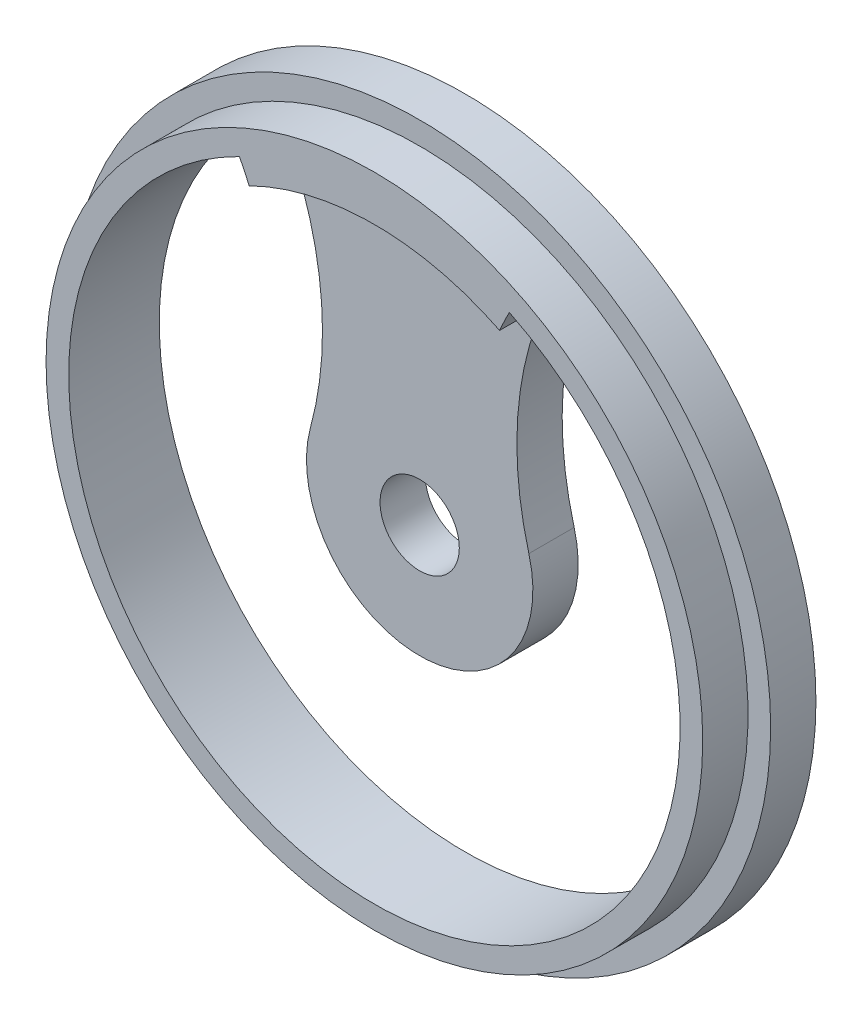
ISO-10303-21;
HEADER;
FILE_DESCRIPTION(('STEP AP214'),'2;1');
FILE_NAME('part.step','',(''),(''),'','','');
FILE_SCHEMA(('AUTOMOTIVE_DESIGN { 1 0 10303 214 1 1 1 1 }'));
ENDSEC;
DATA;
#1=APPLICATION_CONTEXT('core data for automotive mechanical design processes');
#2=APPLICATION_PROTOCOL_DEFINITION('international standard','automotive_design',2000,#1);
#3=PRODUCT_CONTEXT('',#1,'mechanical');
#4=PRODUCT('Part','Part','',(#3));
#5=PRODUCT_RELATED_PRODUCT_CATEGORY('part','',(#4));
#6=PRODUCT_DEFINITION_FORMATION('','',#4);
#7=PRODUCT_DEFINITION_CONTEXT('part definition',#1,'design');
#8=PRODUCT_DEFINITION('design','',#6,#7);
#9=PRODUCT_DEFINITION_SHAPE('','',#8);
#10=(LENGTH_UNIT() NAMED_UNIT(*) SI_UNIT(.MILLI.,.METRE.));
#11=(NAMED_UNIT(*) PLANE_ANGLE_UNIT() SI_UNIT($,.RADIAN.));
#12=(NAMED_UNIT(*) SI_UNIT($,.STERADIAN.) SOLID_ANGLE_UNIT());
#13=UNCERTAINTY_MEASURE_WITH_UNIT(LENGTH_MEASURE(1.E-05),#10,'distance_accuracy_value','');
#14=(GEOMETRIC_REPRESENTATION_CONTEXT(3) GLOBAL_UNCERTAINTY_ASSIGNED_CONTEXT((#13)) GLOBAL_UNIT_ASSIGNED_CONTEXT((#10,
#11,#12)) REPRESENTATION_CONTEXT('',''));
#15=CARTESIAN_POINT('',(0.,0.,0.));
#16=DIRECTION('',(0.,0.,1.));
#17=DIRECTION('',(1.,0.,0.));
#18=AXIS2_PLACEMENT_3D('',#15,#16,#17);
#19=CARTESIAN_POINT('',(0.,0.,2.));
#20=DIRECTION('',(0.,0.,-1.));
#21=DIRECTION('',(-1.,0.,0.));
#22=AXIS2_PLACEMENT_3D('',#19,#20,#21);
#23=CYLINDRICAL_SURFACE('',#22,14.5);
#24=CARTESIAN_POINT('',(0.,0.,4.));
#25=DIRECTION('',(0.,0.,1.));
#26=DIRECTION('',(1.,0.,0.));
#27=AXIS2_PLACEMENT_3D('',#24,#25,#26);
#28=CIRCLE('',#27,14.5);
#29=CARTESIAN_POINT('',(14.5,0.,4.));
#30=VERTEX_POINT('',#29);
#31=EDGE_CURVE('E161',#30,#30,#28,.T.);
#32=ORIENTED_EDGE('',*,*,#31,.F.);
#33=EDGE_LOOP('',(#32));
#34=FACE_BOUND('',#33,.T.);
#35=CARTESIAN_POINT('',(0.,0.,2.));
#36=DIRECTION('',(0.,0.,-1.));
#37=DIRECTION('',(-1.,0.,0.));
#38=AXIS2_PLACEMENT_3D('',#35,#36,#37);
#39=CIRCLE('',#38,14.5);
#40=CARTESIAN_POINT('',(-14.5,0.,2.));
#41=VERTEX_POINT('',#40);
#42=EDGE_CURVE('E169',#41,#41,#39,.T.);
#43=ORIENTED_EDGE('',*,*,#42,.F.);
#44=EDGE_LOOP('',(#43));
#45=FACE_BOUND('',#44,.T.);
#46=ADVANCED_FACE('F39',(#34,#45),#23,.T.);
#47=CARTESIAN_POINT('',(0.,0.,0.));
#48=DIRECTION('',(0.,0.,1.));
#49=DIRECTION('',(1.,0.,0.));
#50=AXIS2_PLACEMENT_3D('',#47,#48,#49);
#51=PLANE('',#50);
#52=CARTESIAN_POINT('',(-19.2031533069764,5.2610638794004,0.));
#53=DIRECTION('',(0.,0.,-1.));
#54=DIRECTION('',(1.,0.,0.));
#55=AXIS2_PLACEMENT_3D('',#52,#53,#54);
#56=CIRCLE('',#55,14.9107983284038);
#57=CARTESIAN_POINT('',(-5.96000858501853,12.1131456552997,0.));
#58=VERTEX_POINT('',#57);
#59=CARTESIAN_POINT('',(-4.82229617071206,1.32115844694565,0.));
#60=VERTEX_POINT('',#59);
#61=EDGE_CURVE('E123',#58,#60,#56,.T.);
#62=ORIENTED_EDGE('',*,*,#61,.F.);
#63=CARTESIAN_POINT('',(0.,0.,0.));
#64=DIRECTION('',(0.,0.,-1.));
#65=DIRECTION('',(-1.,0.,0.));
#66=AXIS2_PLACEMENT_3D('',#63,#64,#65);
#67=CIRCLE('',#66,13.5);
#68=CARTESIAN_POINT('',(5.96000858501854,12.1131456552997,0.));
#69=VERTEX_POINT('',#68);
#70=EDGE_CURVE('E54',#69,#58,#67,.T.);
#71=ORIENTED_EDGE('',*,*,#70,.F.);
#72=CARTESIAN_POINT('',(19.2031533069764,5.2610638794004,0.));
#73=DIRECTION('',(0.,0.,-1.));
#74=DIRECTION('',(-1.,0.,0.));
#75=AXIS2_PLACEMENT_3D('',#72,#73,#74);
#76=CIRCLE('',#75,14.9107983284038);
#77=CARTESIAN_POINT('',(4.82229617071206,1.32115844694565,0.));
#78=VERTEX_POINT('',#77);
#79=EDGE_CURVE('E112',#78,#69,#76,.T.);
#80=ORIENTED_EDGE('',*,*,#79,.F.);
#81=CARTESIAN_POINT('',(0.,0.,0.));
#82=DIRECTION('',(0.,0.,1.));
#83=DIRECTION('',(-1.,0.,0.));
#84=AXIS2_PLACEMENT_3D('',#81,#82,#83);
#85=CIRCLE('',#84,5.);
#86=EDGE_CURVE('E116',#60,#78,#85,.T.);
#87=ORIENTED_EDGE('',*,*,#86,.F.);
#88=EDGE_LOOP('',(#62,#71,#80,#87));
#89=FACE_BOUND('',#88,.T.);
#90=CARTESIAN_POINT('',(0.,0.,0.));
#91=DIRECTION('',(0.,0.,1.));
#92=DIRECTION('',(1.,0.,0.));
#93=AXIS2_PLACEMENT_3D('',#90,#91,#92);
#94=CIRCLE('',#93,1.75);
#95=CARTESIAN_POINT('',(1.75,0.,0.));
#96=VERTEX_POINT('',#95);
#97=EDGE_CURVE('E151',#96,#96,#94,.T.);
#98=ORIENTED_EDGE('',*,*,#97,.T.);
#99=EDGE_LOOP('',(#98));
#100=FACE_BOUND('',#99,.T.);
#101=CARTESIAN_POINT('',(0.,0.,0.));
#102=DIRECTION('',(0.,0.,-1.));
#103=DIRECTION('',(-1.,0.,0.));
#104=AXIS2_PLACEMENT_3D('',#101,#102,#103);
#105=CIRCLE('',#104,15.5);
#106=CARTESIAN_POINT('',(-15.5,0.,0.));
#107=VERTEX_POINT('',#106);
#108=EDGE_CURVE('E142',#107,#107,#105,.T.);
#109=ORIENTED_EDGE('',*,*,#108,.T.);
#110=EDGE_LOOP('',(#109));
#111=FACE_BOUND('',#110,.T.);
#112=ADVANCED_FACE('F194',(#89,#100,#111),#51,.F.);
#113=CARTESIAN_POINT('',(0.,0.,4.));
#114=DIRECTION('',(0.,0.,1.));
#115=DIRECTION('',(1.,0.,0.));
#116=AXIS2_PLACEMENT_3D('',#113,#114,#115);
#117=PLANE('',#116);
#118=CARTESIAN_POINT('',(19.2031533069764,5.2610638794004,4.));
#119=DIRECTION('',(0.,0.,-1.));
#120=DIRECTION('',(-1.,0.,0.));
#121=AXIS2_PLACEMENT_3D('',#118,#119,#120);
#122=CIRCLE('',#121,14.9107983284038);
#123=CARTESIAN_POINT('',(5.53047294116341,11.2099896987936,4.));
#124=VERTEX_POINT('',#123);
#125=CARTESIAN_POINT('',(5.96000858501854,12.1131456552997,4.));
#126=VERTEX_POINT('',#125);
#127=EDGE_CURVE('E97',#124,#126,#122,.T.);
#128=ORIENTED_EDGE('',*,*,#127,.T.);
#129=CARTESIAN_POINT('',(0.,0.,4.));
#130=DIRECTION('',(0.,0.,-1.));
#131=DIRECTION('',(-1.,0.,0.));
#132=AXIS2_PLACEMENT_3D('',#129,#130,#131);
#133=CIRCLE('',#132,13.5);
#134=CARTESIAN_POINT('',(-5.96000858501853,12.1131456552997,4.));
#135=VERTEX_POINT('',#134);
#136=EDGE_CURVE('E93',#126,#135,#133,.T.);
#137=ORIENTED_EDGE('',*,*,#136,.T.);
#138=CARTESIAN_POINT('',(-19.2031533069764,5.2610638794004,4.));
#139=DIRECTION('',(0.,0.,-1.));
#140=DIRECTION('',(1.,0.,0.));
#141=AXIS2_PLACEMENT_3D('',#138,#139,#140);
#142=CIRCLE('',#141,14.9107983284038);
#143=CARTESIAN_POINT('',(-5.53047294116341,11.2099896987936,4.));
#144=VERTEX_POINT('',#143);
#145=EDGE_CURVE('E100',#135,#144,#142,.T.);
#146=ORIENTED_EDGE('',*,*,#145,.T.);
#147=CARTESIAN_POINT('',(0.,0.,4.));
#148=DIRECTION('',(0.,0.,1.));
#149=DIRECTION('',(1.,0.,0.));
#150=AXIS2_PLACEMENT_3D('',#147,#148,#149);
#151=CIRCLE('',#150,12.5);
#152=EDGE_CURVE('E155',#124,#144,#151,.T.);
#153=ORIENTED_EDGE('',*,*,#152,.F.);
#154=EDGE_LOOP('',(#128,#137,#146,#153));
#155=FACE_BOUND('',#154,.T.);
#156=ORIENTED_EDGE('',*,*,#31,.T.);
#157=EDGE_LOOP('',(#156));
#158=FACE_BOUND('',#157,.T.);
#159=ADVANCED_FACE('F109',(#155,#158),#117,.T.);
#160=CARTESIAN_POINT('',(0.,0.,4.));
#161=DIRECTION('',(0.,0.,-1.));
#162=DIRECTION('',(-1.,0.,0.));
#163=AXIS2_PLACEMENT_3D('',#160,#161,#162);
#164=CYLINDRICAL_SURFACE('',#163,12.5);
#165=DIRECTION('',(0.,0.,-1.));
#166=VECTOR('',#165,1.);
#167=CARTESIAN_POINT('',(5.53047294116341,11.2099896987936,2.));
#168=LINE('',#167,#166);
#169=CARTESIAN_POINT('',(5.53047294116341,11.2099896987936,2.));
#170=VERTEX_POINT('',#169);
#171=EDGE_CURVE('E139',#124,#170,#168,.T.);
#172=ORIENTED_EDGE('',*,*,#171,.F.);
#173=ORIENTED_EDGE('',*,*,#152,.T.);
#174=DIRECTION('',(0.,0.,-1.));
#175=VECTOR('',#174,1.);
#176=CARTESIAN_POINT('',(-5.53047294116341,11.2099896987936,2.));
#177=LINE('',#176,#175);
#178=CARTESIAN_POINT('',(-5.53047294116341,11.2099896987936,2.));
#179=VERTEX_POINT('',#178);
#180=EDGE_CURVE('E103',#179,#144,#177,.F.);
#181=ORIENTED_EDGE('',*,*,#180,.F.);
#182=CARTESIAN_POINT('',(0.,0.,2.));
#183=DIRECTION('',(0.,0.,1.));
#184=DIRECTION('',(1.,0.,0.));
#185=AXIS2_PLACEMENT_3D('',#182,#183,#184);
#186=CIRCLE('',#185,12.5);
#187=EDGE_CURVE('E165',#179,#170,#186,.F.);
#188=ORIENTED_EDGE('',*,*,#187,.T.);
#189=EDGE_LOOP('',(#172,#173,#181,#188));
#190=FACE_BOUND('',#189,.T.);
#191=ADVANCED_FACE('F188',(#190),#164,.F.);
#192=CARTESIAN_POINT('',(0.,0.,2.));
#193=DIRECTION('',(0.,0.,1.));
#194=DIRECTION('',(1.,0.,0.));
#195=AXIS2_PLACEMENT_3D('',#192,#193,#194);
#196=PLANE('',#195);
#197=CARTESIAN_POINT('',(19.2031533069764,5.2610638794004,2.));
#198=DIRECTION('',(0.,0.,1.));
#199=DIRECTION('',(1.,0.,0.));
#200=AXIS2_PLACEMENT_3D('',#197,#198,#199);
#201=CIRCLE('',#200,14.9107983284038);
#202=CARTESIAN_POINT('',(4.82229617071206,1.32115844694565,2.));
#203=VERTEX_POINT('',#202);
#204=EDGE_CURVE('E11',#170,#203,#201,.T.);
#205=ORIENTED_EDGE('',*,*,#204,.F.);
#206=ORIENTED_EDGE('',*,*,#187,.F.);
#207=CARTESIAN_POINT('',(-19.2031533069764,5.2610638794004,2.));
#208=DIRECTION('',(0.,0.,1.));
#209=DIRECTION('',(1.,0.,0.));
#210=AXIS2_PLACEMENT_3D('',#207,#208,#209);
#211=CIRCLE('',#210,14.9107983284038);
#212=CARTESIAN_POINT('',(-4.82229617071206,1.32115844694565,2.));
#213=VERTEX_POINT('',#212);
#214=EDGE_CURVE('E173',#213,#179,#211,.T.);
#215=ORIENTED_EDGE('',*,*,#214,.F.);
#216=CARTESIAN_POINT('',(0.,0.,2.));
#217=DIRECTION('',(0.,0.,1.));
#218=DIRECTION('',(1.,0.,0.));
#219=AXIS2_PLACEMENT_3D('',#216,#217,#218);
#220=CIRCLE('',#219,5.);
#221=EDGE_CURVE('E47',#203,#213,#220,.F.);
#222=ORIENTED_EDGE('',*,*,#221,.F.);
#223=EDGE_LOOP('',(#205,#206,#215,#222));
#224=FACE_BOUND('',#223,.T.);
#225=CARTESIAN_POINT('',(0.,0.,2.));
#226=DIRECTION('',(0.,0.,1.));
#227=DIRECTION('',(1.,0.,0.));
#228=AXIS2_PLACEMENT_3D('',#225,#226,#227);
#229=CIRCLE('',#228,1.75);
#230=CARTESIAN_POINT('',(1.75,0.,2.));
#231=VERTEX_POINT('',#230);
#232=EDGE_CURVE('E147',#231,#231,#229,.T.);
#233=ORIENTED_EDGE('',*,*,#232,.F.);
#234=EDGE_LOOP('',(#233));
#235=FACE_BOUND('',#234,.T.);
#236=ADVANCED_FACE('F184',(#224,#235),#196,.T.);
#237=CARTESIAN_POINT('',(0.,0.,0.));
#238=DIRECTION('',(0.,0.,1.));
#239=DIRECTION('',(1.,0.,0.));
#240=AXIS2_PLACEMENT_3D('',#237,#238,#239);
#241=CYLINDRICAL_SURFACE('',#240,1.75);
#242=ORIENTED_EDGE('',*,*,#97,.F.);
#243=EDGE_LOOP('',(#242));
#244=FACE_BOUND('',#243,.T.);
#245=ORIENTED_EDGE('',*,*,#232,.T.);
#246=EDGE_LOOP('',(#245));
#247=FACE_BOUND('',#246,.T.);
#248=ADVANCED_FACE('F204',(#244,#247),#241,.F.);
#249=CARTESIAN_POINT('',(0.,0.,2.));
#250=DIRECTION('',(0.,0.,-1.));
#251=DIRECTION('',(-1.,0.,0.));
#252=AXIS2_PLACEMENT_3D('',#249,#250,#251);
#253=CYLINDRICAL_SURFACE('',#252,15.5);
#254=CARTESIAN_POINT('',(0.,0.,2.));
#255=DIRECTION('',(0.,0.,-1.));
#256=DIRECTION('',(-1.,0.,0.));
#257=AXIS2_PLACEMENT_3D('',#254,#255,#256);
#258=CIRCLE('',#257,15.5);
#259=CARTESIAN_POINT('',(-15.5,0.,2.));
#260=VERTEX_POINT('',#259);
#261=EDGE_CURVE('E143',#260,#260,#258,.T.);
#262=ORIENTED_EDGE('',*,*,#261,.T.);
#263=EDGE_LOOP('',(#262));
#264=FACE_BOUND('',#263,.T.);
#265=ORIENTED_EDGE('',*,*,#108,.F.);
#266=EDGE_LOOP('',(#265));
#267=FACE_BOUND('',#266,.T.);
#268=ADVANCED_FACE('F201',(#264,#267),#253,.T.);
#269=CARTESIAN_POINT('',(0.,0.,2.));
#270=DIRECTION('',(0.,0.,-1.));
#271=DIRECTION('',(-1.,0.,0.));
#272=AXIS2_PLACEMENT_3D('',#269,#270,#271);
#273=PLANE('',#272);
#274=ORIENTED_EDGE('',*,*,#42,.T.);
#275=EDGE_LOOP('',(#274));
#276=FACE_BOUND('',#275,.T.);
#277=ORIENTED_EDGE('',*,*,#261,.F.);
#278=EDGE_LOOP('',(#277));
#279=FACE_BOUND('',#278,.T.);
#280=ADVANCED_FACE('F203',(#276,#279),#273,.F.);
#281=CARTESIAN_POINT('',(0.,0.,4.));
#282=DIRECTION('',(0.,0.,-1.));
#283=DIRECTION('',(-1.,0.,0.));
#284=AXIS2_PLACEMENT_3D('',#281,#282,#283);
#285=CYLINDRICAL_SURFACE('',#284,13.5);
#286=ORIENTED_EDGE('',*,*,#70,.T.);
#287=DIRECTION('',(0.,0.,-1.));
#288=VECTOR('',#287,1.);
#289=CARTESIAN_POINT('',(-5.96000858501853,12.1131456552997,4.));
#290=LINE('',#289,#288);
#291=EDGE_CURVE('E89',#135,#58,#290,.T.);
#292=ORIENTED_EDGE('',*,*,#291,.F.);
#293=ORIENTED_EDGE('',*,*,#136,.F.);
#294=DIRECTION('',(0.,0.,-1.));
#295=VECTOR('',#294,1.);
#296=CARTESIAN_POINT('',(5.96000858501854,12.1131456552997,4.));
#297=LINE('',#296,#295);
#298=EDGE_CURVE('E129',#126,#69,#297,.T.);
#299=ORIENTED_EDGE('',*,*,#298,.T.);
#300=EDGE_LOOP('',(#286,#292,#293,#299));
#301=FACE_BOUND('',#300,.T.);
#302=ADVANCED_FACE('F91',(#301),#285,.F.);
#303=CARTESIAN_POINT('',(19.2031533069764,5.2610638794004,4.));
#304=DIRECTION('',(0.,0.,-1.));
#305=DIRECTION('',(-1.,0.,0.));
#306=AXIS2_PLACEMENT_3D('',#303,#304,#305);
#307=CYLINDRICAL_SURFACE('',#306,14.9107983284038);
#308=ORIENTED_EDGE('',*,*,#171,.T.);
#309=ORIENTED_EDGE('',*,*,#204,.T.);
#310=DIRECTION('',(0.,0.,-1.));
#311=VECTOR('',#310,1.);
#312=CARTESIAN_POINT('',(4.82229617071206,1.32115844694565,4.));
#313=LINE('',#312,#311);
#314=EDGE_CURVE('E132',#203,#78,#313,.T.);
#315=ORIENTED_EDGE('',*,*,#314,.T.);
#316=ORIENTED_EDGE('',*,*,#79,.T.);
#317=ORIENTED_EDGE('',*,*,#298,.F.);
#318=ORIENTED_EDGE('',*,*,#127,.F.);
#319=EDGE_LOOP('',(#308,#309,#315,#316,#317,#318));
#320=FACE_BOUND('',#319,.T.);
#321=ADVANCED_FACE('F190',(#320),#307,.F.);
#322=CARTESIAN_POINT('',(0.,0.,4.));
#323=DIRECTION('',(0.,0.,-1.));
#324=DIRECTION('',(-1.,0.,0.));
#325=AXIS2_PLACEMENT_3D('',#322,#323,#324);
#326=CYLINDRICAL_SURFACE('',#325,5.);
#327=ORIENTED_EDGE('',*,*,#221,.T.);
#328=DIRECTION('',(0.,0.,-1.));
#329=VECTOR('',#328,1.);
#330=CARTESIAN_POINT('',(-4.82229617071206,1.32115844694565,4.));
#331=LINE('',#330,#329);
#332=EDGE_CURVE('E62',#213,#60,#331,.T.);
#333=ORIENTED_EDGE('',*,*,#332,.T.);
#334=ORIENTED_EDGE('',*,*,#86,.T.);
#335=ORIENTED_EDGE('',*,*,#314,.F.);
#336=EDGE_LOOP('',(#327,#333,#334,#335));
#337=FACE_BOUND('',#336,.T.);
#338=ADVANCED_FACE('F180',(#337),#326,.T.);
#339=CARTESIAN_POINT('',(-19.2031533069764,5.2610638794004,4.));
#340=DIRECTION('',(0.,0.,-1.));
#341=DIRECTION('',(-1.,0.,0.));
#342=AXIS2_PLACEMENT_3D('',#339,#340,#341);
#343=CYLINDRICAL_SURFACE('',#342,14.9107983284038);
#344=ORIENTED_EDGE('',*,*,#180,.T.);
#345=ORIENTED_EDGE('',*,*,#145,.F.);
#346=ORIENTED_EDGE('',*,*,#291,.T.);
#347=ORIENTED_EDGE('',*,*,#61,.T.);
#348=ORIENTED_EDGE('',*,*,#332,.F.);
#349=ORIENTED_EDGE('',*,*,#214,.T.);
#350=EDGE_LOOP('',(#344,#345,#346,#347,#348,#349));
#351=FACE_BOUND('',#350,.T.);
#352=ADVANCED_FACE('F101',(#351),#343,.F.);
#353=CLOSED_SHELL('',(#46,#112,#159,#191,#236,#248,#268,#280,#302,#321,#338,#352));
#354=MANIFOLD_SOLID_BREP('B2',#353);
#355=ADVANCED_BREP_SHAPE_REPRESENTATION('',(#18,#354),#14);
#356=SHAPE_DEFINITION_REPRESENTATION(#9,#355);
ENDSEC;
END-ISO-10303-21;
